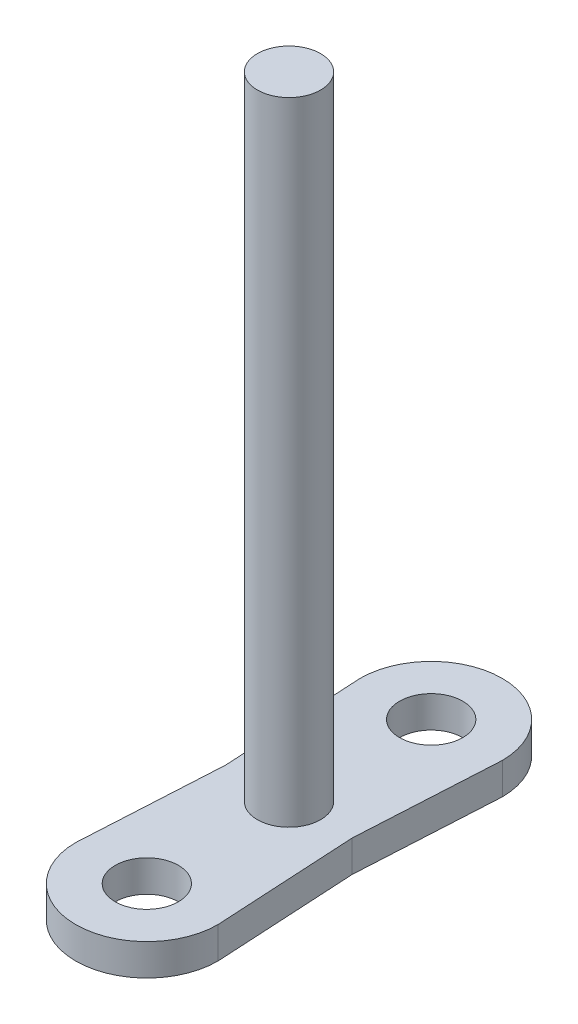
ISO-10303-21;
HEADER;
FILE_DESCRIPTION(('STEP AP214'),'2;1');
FILE_NAME('part.step','',(''),(''),'','','');
FILE_SCHEMA(('AUTOMOTIVE_DESIGN { 1 0 10303 214 1 1 1 1 }'));
ENDSEC;
DATA;
#1=APPLICATION_CONTEXT('core data for automotive mechanical design processes');
#2=APPLICATION_PROTOCOL_DEFINITION('international standard','automotive_design',2000,#1);
#3=PRODUCT_CONTEXT('',#1,'mechanical');
#4=PRODUCT('Part','Part','',(#3));
#5=PRODUCT_RELATED_PRODUCT_CATEGORY('part','',(#4));
#6=PRODUCT_DEFINITION_FORMATION('','',#4);
#7=PRODUCT_DEFINITION_CONTEXT('part definition',#1,'design');
#8=PRODUCT_DEFINITION('design','',#6,#7);
#9=PRODUCT_DEFINITION_SHAPE('','',#8);
#10=(LENGTH_UNIT() NAMED_UNIT(*) SI_UNIT(.MILLI.,.METRE.));
#11=(NAMED_UNIT(*) PLANE_ANGLE_UNIT() SI_UNIT($,.RADIAN.));
#12=(NAMED_UNIT(*) SI_UNIT($,.STERADIAN.) SOLID_ANGLE_UNIT());
#13=UNCERTAINTY_MEASURE_WITH_UNIT(LENGTH_MEASURE(1.E-05),#10,'distance_accuracy_value','');
#14=(GEOMETRIC_REPRESENTATION_CONTEXT(3) GLOBAL_UNCERTAINTY_ASSIGNED_CONTEXT((#13)) GLOBAL_UNIT_ASSIGNED_CONTEXT((#10,
#11,#12)) REPRESENTATION_CONTEXT('',''));
#15=CARTESIAN_POINT('',(0.,0.,0.));
#16=DIRECTION('',(0.,0.,1.));
#17=DIRECTION('',(1.,0.,0.));
#18=AXIS2_PLACEMENT_3D('',#15,#16,#17);
#19=CARTESIAN_POINT('',(0.,-2.,-9.));
#20=DIRECTION('',(0.,1.,0.));
#21=DIRECTION('',(0.,0.,1.));
#22=AXIS2_PLACEMENT_3D('',#19,#20,#21);
#23=CYLINDRICAL_SURFACE('',#22,2.);
#24=CARTESIAN_POINT('',(0.,-2.,-9.));
#25=DIRECTION('',(0.,-1.,0.));
#26=DIRECTION('',(0.,0.,-1.));
#27=AXIS2_PLACEMENT_3D('',#24,#25,#26);
#28=CIRCLE('',#27,2.);
#29=CARTESIAN_POINT('',(0.,-2.,-11.));
#30=VERTEX_POINT('',#29);
#31=EDGE_CURVE('E166',#30,#30,#28,.F.);
#32=ORIENTED_EDGE('',*,*,#31,.F.);
#33=EDGE_LOOP('',(#32));
#34=FACE_BOUND('',#33,.T.);
#35=CARTESIAN_POINT('',(0.,0.,-9.));
#36=DIRECTION('',(0.,-1.,0.));
#37=DIRECTION('',(0.,0.,-1.));
#38=AXIS2_PLACEMENT_3D('',#35,#36,#37);
#39=CIRCLE('',#38,2.);
#40=CARTESIAN_POINT('',(0.,0.,-11.));
#41=VERTEX_POINT('',#40);
#42=EDGE_CURVE('E167',#41,#41,#39,.F.);
#43=ORIENTED_EDGE('',*,*,#42,.T.);
#44=EDGE_LOOP('',(#43));
#45=FACE_BOUND('',#44,.T.);
#46=ADVANCED_FACE('F79',(#34,#45),#23,.F.);
#47=CARTESIAN_POINT('',(0.,-2.,-9.));
#48=DIRECTION('',(0.,1.,0.));
#49=DIRECTION('',(0.,0.,1.));
#50=AXIS2_PLACEMENT_3D('',#47,#48,#49);
#51=CYLINDRICAL_SURFACE('',#50,4.5);
#52=CARTESIAN_POINT('',(0.,0.,-9.));
#53=DIRECTION('',(0.,-1.,0.));
#54=DIRECTION('',(0.,0.,-1.));
#55=AXIS2_PLACEMENT_3D('',#52,#53,#54);
#56=CIRCLE('',#55,4.5);
#57=CARTESIAN_POINT('',(4.5,0.,-9.));
#58=VERTEX_POINT('',#57);
#59=CARTESIAN_POINT('',(-4.5,0.,-9.));
#60=VERTEX_POINT('',#59);
#61=EDGE_CURVE('E174',#58,#60,#56,.F.);
#62=ORIENTED_EDGE('',*,*,#61,.F.);
#63=DIRECTION('',(0.,1.,0.));
#64=VECTOR('',#63,1.);
#65=CARTESIAN_POINT('',(4.5,-2.,-9.));
#66=LINE('',#65,#64);
#67=CARTESIAN_POINT('',(4.5,-2.,-9.));
#68=VERTEX_POINT('',#67);
#69=EDGE_CURVE('E89',#68,#58,#66,.T.);
#70=ORIENTED_EDGE('',*,*,#69,.F.);
#71=CARTESIAN_POINT('',(0.,-2.,-9.));
#72=DIRECTION('',(0.,-1.,0.));
#73=DIRECTION('',(0.,0.,-1.));
#74=AXIS2_PLACEMENT_3D('',#71,#72,#73);
#75=CIRCLE('',#74,4.5);
#76=CARTESIAN_POINT('',(-4.5,-2.,-9.));
#77=VERTEX_POINT('',#76);
#78=EDGE_CURVE('E182',#68,#77,#75,.F.);
#79=ORIENTED_EDGE('',*,*,#78,.T.);
#80=DIRECTION('',(0.,1.,0.));
#81=VECTOR('',#80,1.);
#82=CARTESIAN_POINT('',(-4.5,-2.,-9.));
#83=LINE('',#82,#81);
#84=EDGE_CURVE('E13',#77,#60,#83,.T.);
#85=ORIENTED_EDGE('',*,*,#84,.T.);
#86=EDGE_LOOP('',(#62,#70,#79,#85));
#87=FACE_BOUND('',#86,.T.);
#88=ADVANCED_FACE('F198',(#87),#51,.T.);
#89=CARTESIAN_POINT('',(3.98769230769231,-2.,0.221538461538461));
#90=DIRECTION('',(-0.998460353205412,0.,-0.0554700196225229));
#91=DIRECTION('',(-0.0554700196225229,0.,0.998460353205412));
#92=AXIS2_PLACEMENT_3D('',#89,#90,#91);
#93=PLANE('',#92);
#94=DIRECTION('',(-0.0554700196225229,0.,0.998460353205413));
#95=VECTOR('',#94,1.);
#96=CARTESIAN_POINT('',(3.98769230769231,0.,0.221538461538461));
#97=LINE('',#96,#95);
#98=CARTESIAN_POINT('',(4.,0.,0.));
#99=VERTEX_POINT('',#98);
#100=EDGE_CURVE('E171',#58,#99,#97,.T.);
#101=ORIENTED_EDGE('',*,*,#100,.T.);
#102=DIRECTION('',(0.,1.,0.));
#103=VECTOR('',#102,1.);
#104=CARTESIAN_POINT('',(4.,-2.,0.));
#105=LINE('',#104,#103);
#106=CARTESIAN_POINT('',(4.,-2.,0.));
#107=VERTEX_POINT('',#106);
#108=EDGE_CURVE('E163',#107,#99,#105,.T.);
#109=ORIENTED_EDGE('',*,*,#108,.F.);
#110=DIRECTION('',(-0.0554700196225229,0.,0.998460353205413));
#111=VECTOR('',#110,1.);
#112=CARTESIAN_POINT('',(3.98769230769231,-2.,0.221538461538461));
#113=LINE('',#112,#111);
#114=EDGE_CURVE('E179',#68,#107,#113,.T.);
#115=ORIENTED_EDGE('',*,*,#114,.F.);
#116=ORIENTED_EDGE('',*,*,#69,.T.);
#117=EDGE_LOOP('',(#101,#109,#115,#116));
#118=FACE_BOUND('',#117,.T.);
#119=ADVANCED_FACE('F202',(#118),#93,.F.);
#120=CARTESIAN_POINT('',(-3.98769230769231,-2.,0.221538461538461));
#121=DIRECTION('',(-0.998460353205412,0.,0.0554700196225229));
#122=DIRECTION('',(0.0554700196225229,0.,0.998460353205412));
#123=AXIS2_PLACEMENT_3D('',#120,#121,#122);
#124=PLANE('',#123);
#125=DIRECTION('',(0.0554700196225229,0.,0.998460353205413));
#126=VECTOR('',#125,1.);
#127=CARTESIAN_POINT('',(-3.98769230769231,0.,0.221538461538461));
#128=LINE('',#127,#126);
#129=CARTESIAN_POINT('',(-4.,0.,0.));
#130=VERTEX_POINT('',#129);
#131=EDGE_CURVE('E147',#60,#130,#128,.T.);
#132=ORIENTED_EDGE('',*,*,#131,.F.);
#133=ORIENTED_EDGE('',*,*,#84,.F.);
#134=DIRECTION('',(0.0554700196225229,0.,0.998460353205413));
#135=VECTOR('',#134,1.);
#136=CARTESIAN_POINT('',(-3.98769230769231,-2.,0.221538461538461));
#137=LINE('',#136,#135);
#138=CARTESIAN_POINT('',(-4.,-2.,0.));
#139=VERTEX_POINT('',#138);
#140=EDGE_CURVE('E170',#77,#139,#137,.T.);
#141=ORIENTED_EDGE('',*,*,#140,.T.);
#142=DIRECTION('',(0.,1.,0.));
#143=VECTOR('',#142,1.);
#144=CARTESIAN_POINT('',(-4.,-2.,0.));
#145=LINE('',#144,#143);
#146=EDGE_CURVE('E98',#139,#130,#145,.T.);
#147=ORIENTED_EDGE('',*,*,#146,.T.);
#148=EDGE_LOOP('',(#132,#133,#141,#147));
#149=FACE_BOUND('',#148,.T.);
#150=ADVANCED_FACE('F189',(#149),#124,.T.);
#151=CARTESIAN_POINT('',(0.,0.,0.));
#152=DIRECTION('',(0.,-1.,0.));
#153=DIRECTION('',(0.,0.,-1.));
#154=AXIS2_PLACEMENT_3D('',#151,#152,#153);
#155=PLANE('',#154);
#156=ORIENTED_EDGE('',*,*,#131,.T.);
#157=DIRECTION('',(0.0554700196225229,0.,-0.998460353205413));
#158=VECTOR('',#157,1.);
#159=CARTESIAN_POINT('',(-3.98769230769231,0.,-0.221538461538461));
#160=LINE('',#159,#158);
#161=CARTESIAN_POINT('',(-4.5,0.,9.));
#162=VERTEX_POINT('',#161);
#163=EDGE_CURVE('E136',#162,#130,#160,.T.);
#164=ORIENTED_EDGE('',*,*,#163,.F.);
#165=CARTESIAN_POINT('',(0.,0.,9.));
#166=DIRECTION('',(0.,-1.,0.));
#167=DIRECTION('',(0.,0.,-1.));
#168=AXIS2_PLACEMENT_3D('',#165,#166,#167);
#169=CIRCLE('',#168,4.5);
#170=CARTESIAN_POINT('',(4.5,0.,9.));
#171=VERTEX_POINT('',#170);
#172=EDGE_CURVE('E128',#171,#162,#169,.T.);
#173=ORIENTED_EDGE('',*,*,#172,.F.);
#174=DIRECTION('',(-0.0554700196225229,0.,-0.998460353205413));
#175=VECTOR('',#174,1.);
#176=CARTESIAN_POINT('',(3.98769230769231,0.,-0.221538461538461));
#177=LINE('',#176,#175);
#178=EDGE_CURVE('E137',#171,#99,#177,.T.);
#179=ORIENTED_EDGE('',*,*,#178,.T.);
#180=ORIENTED_EDGE('',*,*,#100,.F.);
#181=ORIENTED_EDGE('',*,*,#61,.T.);
#182=EDGE_LOOP('',(#156,#164,#173,#179,#180,#181));
#183=FACE_BOUND('',#182,.T.);
#184=ORIENTED_EDGE('',*,*,#42,.F.);
#185=EDGE_LOOP('',(#184));
#186=FACE_BOUND('',#185,.T.);
#187=CARTESIAN_POINT('',(0.,0.,9.));
#188=DIRECTION('',(0.,-1.,0.));
#189=DIRECTION('',(0.,0.,-1.));
#190=AXIS2_PLACEMENT_3D('',#187,#188,#189);
#191=CIRCLE('',#190,2.);
#192=CARTESIAN_POINT('',(0.,0.,7.));
#193=VERTEX_POINT('',#192);
#194=EDGE_CURVE('E148',#193,#193,#191,.T.);
#195=ORIENTED_EDGE('',*,*,#194,.T.);
#196=EDGE_LOOP('',(#195));
#197=FACE_BOUND('',#196,.T.);
#198=ADVANCED_FACE('F143',(#183,#186,#197),#155,.F.);
#199=CARTESIAN_POINT('',(0.,-2.,0.));
#200=DIRECTION('',(0.,-1.,0.));
#201=DIRECTION('',(0.,0.,-1.));
#202=AXIS2_PLACEMENT_3D('',#199,#200,#201);
#203=PLANE('',#202);
#204=ORIENTED_EDGE('',*,*,#140,.F.);
#205=ORIENTED_EDGE('',*,*,#78,.F.);
#206=ORIENTED_EDGE('',*,*,#114,.T.);
#207=DIRECTION('',(-0.0554700196225229,0.,-0.998460353205413));
#208=VECTOR('',#207,1.);
#209=CARTESIAN_POINT('',(3.98769230769231,-2.,-0.221538461538461));
#210=LINE('',#209,#208);
#211=CARTESIAN_POINT('',(4.5,-2.,9.));
#212=VERTEX_POINT('',#211);
#213=EDGE_CURVE('E151',#212,#107,#210,.T.);
#214=ORIENTED_EDGE('',*,*,#213,.F.);
#215=CARTESIAN_POINT('',(0.,-2.,9.));
#216=DIRECTION('',(0.,-1.,0.));
#217=DIRECTION('',(0.,0.,-1.));
#218=AXIS2_PLACEMENT_3D('',#215,#216,#217);
#219=CIRCLE('',#218,4.5);
#220=CARTESIAN_POINT('',(-4.5,-2.,9.));
#221=VERTEX_POINT('',#220);
#222=EDGE_CURVE('E158',#212,#221,#219,.T.);
#223=ORIENTED_EDGE('',*,*,#222,.T.);
#224=DIRECTION('',(0.0554700196225229,0.,-0.998460353205413));
#225=VECTOR('',#224,1.);
#226=CARTESIAN_POINT('',(-3.98769230769231,-2.,-0.221538461538461));
#227=LINE('',#226,#225);
#228=EDGE_CURVE('E141',#221,#139,#227,.T.);
#229=ORIENTED_EDGE('',*,*,#228,.T.);
#230=EDGE_LOOP('',(#204,#205,#206,#214,#223,#229));
#231=FACE_BOUND('',#230,.T.);
#232=ORIENTED_EDGE('',*,*,#31,.T.);
#233=EDGE_LOOP('',(#232));
#234=FACE_BOUND('',#233,.T.);
#235=CARTESIAN_POINT('',(0.,-2.,9.));
#236=DIRECTION('',(0.,-1.,0.));
#237=DIRECTION('',(0.,0.,-1.));
#238=AXIS2_PLACEMENT_3D('',#235,#236,#237);
#239=CIRCLE('',#238,2.);
#240=CARTESIAN_POINT('',(0.,-2.,7.));
#241=VERTEX_POINT('',#240);
#242=EDGE_CURVE('E142',#241,#241,#239,.T.);
#243=ORIENTED_EDGE('',*,*,#242,.F.);
#244=EDGE_LOOP('',(#243));
#245=FACE_BOUND('',#244,.T.);
#246=ADVANCED_FACE('F192',(#231,#234,#245),#203,.T.);
#247=CARTESIAN_POINT('',(0.,-2.,9.));
#248=DIRECTION('',(0.,1.,0.));
#249=DIRECTION('',(0.,0.,1.));
#250=AXIS2_PLACEMENT_3D('',#247,#248,#249);
#251=CYLINDRICAL_SURFACE('',#250,2.);
#252=ORIENTED_EDGE('',*,*,#242,.T.);
#253=EDGE_LOOP('',(#252));
#254=FACE_BOUND('',#253,.T.);
#255=ORIENTED_EDGE('',*,*,#194,.F.);
#256=EDGE_LOOP('',(#255));
#257=FACE_BOUND('',#256,.T.);
#258=ADVANCED_FACE('F211',(#254,#257),#251,.F.);
#259=CARTESIAN_POINT('',(0.,-2.,9.));
#260=DIRECTION('',(0.,1.,0.));
#261=DIRECTION('',(0.,0.,1.));
#262=AXIS2_PLACEMENT_3D('',#259,#260,#261);
#263=CYLINDRICAL_SURFACE('',#262,4.5);
#264=ORIENTED_EDGE('',*,*,#172,.T.);
#265=DIRECTION('',(0.,1.,0.));
#266=VECTOR('',#265,1.);
#267=CARTESIAN_POINT('',(-4.5,-2.,9.));
#268=LINE('',#267,#266);
#269=EDGE_CURVE('E131',#221,#162,#268,.T.);
#270=ORIENTED_EDGE('',*,*,#269,.F.);
#271=ORIENTED_EDGE('',*,*,#222,.F.);
#272=DIRECTION('',(0.,1.,0.));
#273=VECTOR('',#272,1.);
#274=CARTESIAN_POINT('',(4.5,-2.,9.));
#275=LINE('',#274,#273);
#276=EDGE_CURVE('E83',#212,#171,#275,.T.);
#277=ORIENTED_EDGE('',*,*,#276,.T.);
#278=EDGE_LOOP('',(#264,#270,#271,#277));
#279=FACE_BOUND('',#278,.T.);
#280=ADVANCED_FACE('F130',(#279),#263,.T.);
#281=CARTESIAN_POINT('',(3.98769230769231,-2.,-0.221538461538461));
#282=DIRECTION('',(0.998460353205412,0.,-0.0554700196225229));
#283=DIRECTION('',(-0.0554700196225229,0.,-0.998460353205412));
#284=AXIS2_PLACEMENT_3D('',#281,#282,#283);
#285=PLANE('',#284);
#286=ORIENTED_EDGE('',*,*,#178,.F.);
#287=ORIENTED_EDGE('',*,*,#276,.F.);
#288=ORIENTED_EDGE('',*,*,#213,.T.);
#289=ORIENTED_EDGE('',*,*,#108,.T.);
#290=EDGE_LOOP('',(#286,#287,#288,#289));
#291=FACE_BOUND('',#290,.T.);
#292=ADVANCED_FACE('F81',(#291),#285,.T.);
#293=CARTESIAN_POINT('',(-3.98769230769231,-2.,-0.221538461538461));
#294=DIRECTION('',(0.998460353205412,0.,0.0554700196225229));
#295=DIRECTION('',(0.0554700196225229,0.,-0.998460353205412));
#296=AXIS2_PLACEMENT_3D('',#293,#294,#295);
#297=PLANE('',#296);
#298=ORIENTED_EDGE('',*,*,#163,.T.);
#299=ORIENTED_EDGE('',*,*,#146,.F.);
#300=ORIENTED_EDGE('',*,*,#228,.F.);
#301=ORIENTED_EDGE('',*,*,#269,.T.);
#302=EDGE_LOOP('',(#298,#299,#300,#301));
#303=FACE_BOUND('',#302,.T.);
#304=ADVANCED_FACE('F139',(#303),#297,.F.);
#305=CLOSED_SHELL('',(#46,#88,#119,#150,#198,#246,#258,#280,#292,#304));
#306=MANIFOLD_SOLID_BREP('B2',#305);
#307=CARTESIAN_POINT('',(0.,40.,0.));
#308=DIRECTION('',(0.,-1.,0.));
#309=DIRECTION('',(0.,0.,-1.));
#310=AXIS2_PLACEMENT_3D('',#307,#308,#309);
#311=CYLINDRICAL_SURFACE('',#310,2.);
#312=CARTESIAN_POINT('',(0.,40.,0.));
#313=DIRECTION('',(0.,1.,0.));
#314=DIRECTION('',(0.,0.,1.));
#315=AXIS2_PLACEMENT_3D('',#312,#313,#314);
#316=CIRCLE('',#315,2.);
#317=CARTESIAN_POINT('',(0.,40.,2.));
#318=VERTEX_POINT('',#317);
#319=EDGE_CURVE('E78',#318,#318,#316,.T.);
#320=ORIENTED_EDGE('',*,*,#319,.F.);
#321=EDGE_LOOP('',(#320));
#322=FACE_BOUND('',#321,.T.);
#323=CARTESIAN_POINT('',(0.,0.,0.));
#324=DIRECTION('',(0.,1.,0.));
#325=DIRECTION('',(0.,0.,1.));
#326=AXIS2_PLACEMENT_3D('',#323,#324,#325);
#327=CIRCLE('',#326,2.);
#328=CARTESIAN_POINT('',(0.,0.,2.));
#329=VERTEX_POINT('',#328);
#330=EDGE_CURVE('E324',#329,#329,#327,.T.);
#331=ORIENTED_EDGE('',*,*,#330,.T.);
#332=EDGE_LOOP('',(#331));
#333=FACE_BOUND('',#332,.T.);
#334=ADVANCED_FACE('F321',(#322,#333),#311,.T.);
#335=CARTESIAN_POINT('',(0.,40.,0.));
#336=DIRECTION('',(0.,1.,0.));
#337=DIRECTION('',(0.,0.,1.));
#338=AXIS2_PLACEMENT_3D('',#335,#336,#337);
#339=PLANE('',#338);
#340=ORIENTED_EDGE('',*,*,#319,.T.);
#341=EDGE_LOOP('',(#340));
#342=FACE_BOUND('',#341,.T.);
#343=ADVANCED_FACE('F338',(#342),#339,.T.);
#344=CARTESIAN_POINT('',(0.,0.,0.));
#345=DIRECTION('',(0.,1.,0.));
#346=DIRECTION('',(0.,0.,1.));
#347=AXIS2_PLACEMENT_3D('',#344,#345,#346);
#348=PLANE('',#347);
#349=ORIENTED_EDGE('',*,*,#330,.F.);
#350=EDGE_LOOP('',(#349));
#351=FACE_BOUND('',#350,.T.);
#352=ADVANCED_FACE('F336',(#351),#348,.F.);
#353=CLOSED_SHELL('',(#334,#343,#352));
#354=MANIFOLD_SOLID_BREP('B7',#353);
#355=ADVANCED_BREP_SHAPE_REPRESENTATION('',(#18,#306,#354),#14);
#356=SHAPE_DEFINITION_REPRESENTATION(#9,#355);
ENDSEC;
END-ISO-10303-21;
